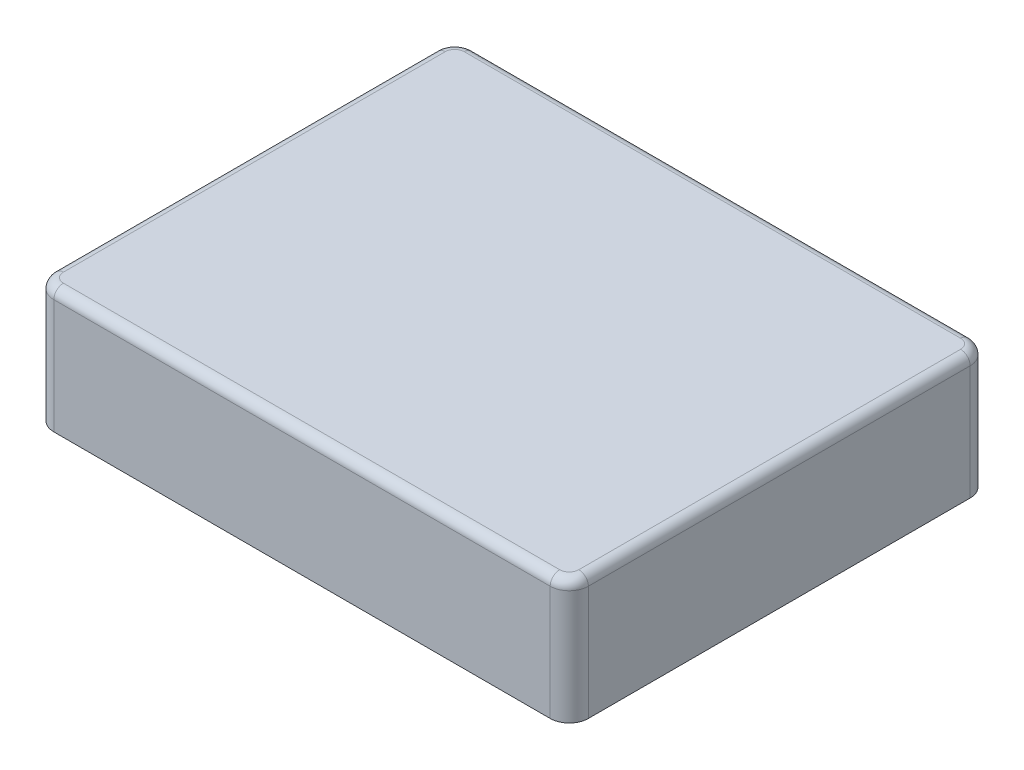
ISO-10303-21;
HEADER;
FILE_DESCRIPTION(('STEP AP214'),'2;1');
FILE_NAME('part.step','',(''),(''),'','','');
FILE_SCHEMA(('AUTOMOTIVE_DESIGN { 1 0 10303 214 1 1 1 1 }'));
ENDSEC;
DATA;
#1=APPLICATION_CONTEXT('core data for automotive mechanical design processes');
#2=APPLICATION_PROTOCOL_DEFINITION('international standard','automotive_design',2000,#1);
#3=PRODUCT_CONTEXT('',#1,'mechanical');
#4=PRODUCT('Part','Part','',(#3));
#5=PRODUCT_RELATED_PRODUCT_CATEGORY('part','',(#4));
#6=PRODUCT_DEFINITION_FORMATION('','',#4);
#7=PRODUCT_DEFINITION_CONTEXT('part definition',#1,'design');
#8=PRODUCT_DEFINITION('design','',#6,#7);
#9=PRODUCT_DEFINITION_SHAPE('','',#8);
#10=(LENGTH_UNIT() NAMED_UNIT(*) SI_UNIT(.MILLI.,.METRE.));
#11=(NAMED_UNIT(*) PLANE_ANGLE_UNIT() SI_UNIT($,.RADIAN.));
#12=(NAMED_UNIT(*) SI_UNIT($,.STERADIAN.) SOLID_ANGLE_UNIT());
#13=UNCERTAINTY_MEASURE_WITH_UNIT(LENGTH_MEASURE(1.E-05),#10,'distance_accuracy_value','');
#14=(GEOMETRIC_REPRESENTATION_CONTEXT(3) GLOBAL_UNCERTAINTY_ASSIGNED_CONTEXT((#13)) GLOBAL_UNIT_ASSIGNED_CONTEXT((#10,
#11,#12)) REPRESENTATION_CONTEXT('',''));
#15=CARTESIAN_POINT('',(0.,0.,0.));
#16=DIRECTION('',(0.,0.,1.));
#17=DIRECTION('',(1.,0.,0.));
#18=AXIS2_PLACEMENT_3D('',#15,#16,#17);
#19=CARTESIAN_POINT('',(0.,13.,0.));
#20=DIRECTION('',(0.,1.,0.));
#21=DIRECTION('',(0.,0.,1.));
#22=AXIS2_PLACEMENT_3D('',#19,#20,#21);
#23=PLANE('',#22);
#24=CARTESIAN_POINT('',(-26.,13.,-20.));
#25=DIRECTION('',(0.,1.,0.));
#26=DIRECTION('',(0.,0.,1.));
#27=AXIS2_PLACEMENT_3D('',#24,#25,#26);
#28=CIRCLE('',#27,1.);
#29=CARTESIAN_POINT('',(-27.,13.,-20.));
#30=VERTEX_POINT('',#29);
#31=CARTESIAN_POINT('',(-26.,13.,-21.));
#32=VERTEX_POINT('',#31);
#33=EDGE_CURVE('E278',#30,#32,#28,.F.);
#34=ORIENTED_EDGE('',*,*,#33,.F.);
#35=DIRECTION('',(0.,0.,1.));
#36=VECTOR('',#35,1.);
#37=CARTESIAN_POINT('',(-27.,13.,22.));
#38=LINE('',#37,#36);
#39=CARTESIAN_POINT('',(-27.,13.,20.));
#40=VERTEX_POINT('',#39);
#41=EDGE_CURVE('E245',#30,#40,#38,.T.);
#42=ORIENTED_EDGE('',*,*,#41,.T.);
#43=CARTESIAN_POINT('',(-26.,13.,20.));
#44=DIRECTION('',(0.,1.,0.));
#45=DIRECTION('',(0.,0.,1.));
#46=AXIS2_PLACEMENT_3D('',#43,#44,#45);
#47=CIRCLE('',#46,1.);
#48=CARTESIAN_POINT('',(-26.,13.,21.));
#49=VERTEX_POINT('',#48);
#50=EDGE_CURVE('E153',#49,#40,#47,.F.);
#51=ORIENTED_EDGE('',*,*,#50,.F.);
#52=DIRECTION('',(1.,0.,0.));
#53=VECTOR('',#52,1.);
#54=CARTESIAN_POINT('',(28.,13.,21.));
#55=LINE('',#54,#53);
#56=CARTESIAN_POINT('',(26.,13.,21.));
#57=VERTEX_POINT('',#56);
#58=EDGE_CURVE('E147',#49,#57,#55,.T.);
#59=ORIENTED_EDGE('',*,*,#58,.T.);
#60=CARTESIAN_POINT('',(26.,13.,20.));
#61=DIRECTION('',(0.,1.,0.));
#62=DIRECTION('',(0.,0.,1.));
#63=AXIS2_PLACEMENT_3D('',#60,#61,#62);
#64=CIRCLE('',#63,1.);
#65=CARTESIAN_POINT('',(27.,13.,20.));
#66=VERTEX_POINT('',#65);
#67=EDGE_CURVE('E141',#66,#57,#64,.F.);
#68=ORIENTED_EDGE('',*,*,#67,.F.);
#69=DIRECTION('',(0.,0.,-1.));
#70=VECTOR('',#69,1.);
#71=CARTESIAN_POINT('',(27.,13.,-22.));
#72=LINE('',#71,#70);
#73=CARTESIAN_POINT('',(27.,13.,-20.));
#74=VERTEX_POINT('',#73);
#75=EDGE_CURVE('E144',#66,#74,#72,.T.);
#76=ORIENTED_EDGE('',*,*,#75,.T.);
#77=CARTESIAN_POINT('',(26.,13.,-20.));
#78=DIRECTION('',(0.,1.,0.));
#79=DIRECTION('',(0.,0.,1.));
#80=AXIS2_PLACEMENT_3D('',#77,#78,#79);
#81=CIRCLE('',#80,1.);
#82=CARTESIAN_POINT('',(26.,13.,-21.));
#83=VERTEX_POINT('',#82);
#84=EDGE_CURVE('E154',#83,#74,#81,.F.);
#85=ORIENTED_EDGE('',*,*,#84,.F.);
#86=DIRECTION('',(-1.,0.,0.));
#87=VECTOR('',#86,1.);
#88=CARTESIAN_POINT('',(-28.,13.,-21.));
#89=LINE('',#88,#87);
#90=EDGE_CURVE('E165',#83,#32,#89,.T.);
#91=ORIENTED_EDGE('',*,*,#90,.T.);
#92=EDGE_LOOP('',(#34,#42,#51,#59,#68,#76,#85,#91));
#93=FACE_BOUND('',#92,.T.);
#94=ADVANCED_FACE('F48',(#93),#23,.T.);
#95=CARTESIAN_POINT('',(-28.,13.,-22.));
#96=DIRECTION('',(1.,0.,0.));
#97=DIRECTION('',(0.,0.,-1.));
#98=AXIS2_PLACEMENT_3D('',#95,#96,#97);
#99=PLANE('',#98);
#100=DIRECTION('',(0.,0.,1.));
#101=VECTOR('',#100,1.);
#102=CARTESIAN_POINT('',(-28.,0.,-22.));
#103=LINE('',#102,#101);
#104=CARTESIAN_POINT('',(-28.,0.,-20.));
#105=VERTEX_POINT('',#104);
#106=CARTESIAN_POINT('',(-28.,0.,20.));
#107=VERTEX_POINT('',#106);
#108=EDGE_CURVE('E215',#105,#107,#103,.T.);
#109=ORIENTED_EDGE('',*,*,#108,.T.);
#110=DIRECTION('',(0.,-1.,0.));
#111=VECTOR('',#110,1.);
#112=CARTESIAN_POINT('',(-28.,13.,20.));
#113=LINE('',#112,#111);
#114=CARTESIAN_POINT('',(-28.,12.,20.));
#115=VERTEX_POINT('',#114);
#116=EDGE_CURVE('E11',#107,#115,#113,.F.);
#117=ORIENTED_EDGE('',*,*,#116,.T.);
#118=DIRECTION('',(0.,0.,1.));
#119=VECTOR('',#118,1.);
#120=CARTESIAN_POINT('',(-28.,12.,-22.));
#121=LINE('',#120,#119);
#122=CARTESIAN_POINT('',(-28.,12.,-20.));
#123=VERTEX_POINT('',#122);
#124=EDGE_CURVE('E269',#115,#123,#121,.F.);
#125=ORIENTED_EDGE('',*,*,#124,.T.);
#126=DIRECTION('',(0.,-1.,0.));
#127=VECTOR('',#126,1.);
#128=CARTESIAN_POINT('',(-28.,13.,-20.));
#129=LINE('',#128,#127);
#130=EDGE_CURVE('E58',#123,#105,#129,.T.);
#131=ORIENTED_EDGE('',*,*,#130,.T.);
#132=EDGE_LOOP('',(#109,#117,#125,#131));
#133=FACE_BOUND('',#132,.T.);
#134=ADVANCED_FACE('F318',(#133),#99,.F.);
#135=CARTESIAN_POINT('',(-28.,13.,22.));
#136=DIRECTION('',(0.,0.,-1.));
#137=DIRECTION('',(-1.,0.,0.));
#138=AXIS2_PLACEMENT_3D('',#135,#136,#137);
#139=PLANE('',#138);
#140=DIRECTION('',(1.,0.,0.));
#141=VECTOR('',#140,1.);
#142=CARTESIAN_POINT('',(-28.,0.,22.));
#143=LINE('',#142,#141);
#144=CARTESIAN_POINT('',(-26.,0.,22.));
#145=VERTEX_POINT('',#144);
#146=CARTESIAN_POINT('',(26.,0.,22.));
#147=VERTEX_POINT('',#146);
#148=EDGE_CURVE('E252',#145,#147,#143,.T.);
#149=ORIENTED_EDGE('',*,*,#148,.T.);
#150=DIRECTION('',(0.,-1.,0.));
#151=VECTOR('',#150,1.);
#152=CARTESIAN_POINT('',(26.,13.,22.));
#153=LINE('',#152,#151);
#154=CARTESIAN_POINT('',(26.,12.,22.));
#155=VERTEX_POINT('',#154);
#156=EDGE_CURVE('E206',#147,#155,#153,.F.);
#157=ORIENTED_EDGE('',*,*,#156,.T.);
#158=DIRECTION('',(1.,0.,0.));
#159=VECTOR('',#158,1.);
#160=CARTESIAN_POINT('',(-28.,12.,22.));
#161=LINE('',#160,#159);
#162=CARTESIAN_POINT('',(-26.,12.,22.));
#163=VERTEX_POINT('',#162);
#164=EDGE_CURVE('E266',#155,#163,#161,.F.);
#165=ORIENTED_EDGE('',*,*,#164,.T.);
#166=DIRECTION('',(0.,-1.,0.));
#167=VECTOR('',#166,1.);
#168=CARTESIAN_POINT('',(-26.,13.,22.));
#169=LINE('',#168,#167);
#170=EDGE_CURVE('E73',#163,#145,#169,.T.);
#171=ORIENTED_EDGE('',*,*,#170,.T.);
#172=EDGE_LOOP('',(#149,#157,#165,#171));
#173=FACE_BOUND('',#172,.T.);
#174=ADVANCED_FACE('F297',(#173),#139,.F.);
#175=CARTESIAN_POINT('',(28.,13.,-22.));
#176=DIRECTION('',(-1.,0.,0.));
#177=DIRECTION('',(0.,0.,1.));
#178=AXIS2_PLACEMENT_3D('',#175,#176,#177);
#179=PLANE('',#178);
#180=DIRECTION('',(0.,0.,-1.));
#181=VECTOR('',#180,1.);
#182=CARTESIAN_POINT('',(28.,0.,-22.));
#183=LINE('',#182,#181);
#184=CARTESIAN_POINT('',(28.,0.,20.));
#185=VERTEX_POINT('',#184);
#186=CARTESIAN_POINT('',(28.,0.,-20.));
#187=VERTEX_POINT('',#186);
#188=EDGE_CURVE('E246',#185,#187,#183,.T.);
#189=ORIENTED_EDGE('',*,*,#188,.T.);
#190=DIRECTION('',(0.,-1.,0.));
#191=VECTOR('',#190,1.);
#192=CARTESIAN_POINT('',(28.,13.,-20.));
#193=LINE('',#192,#191);
#194=CARTESIAN_POINT('',(28.,12.,-20.));
#195=VERTEX_POINT('',#194);
#196=EDGE_CURVE('E201',#187,#195,#193,.F.);
#197=ORIENTED_EDGE('',*,*,#196,.T.);
#198=DIRECTION('',(0.,0.,-1.));
#199=VECTOR('',#198,1.);
#200=CARTESIAN_POINT('',(28.,12.,22.));
#201=LINE('',#200,#199);
#202=CARTESIAN_POINT('',(28.,12.,20.));
#203=VERTEX_POINT('',#202);
#204=EDGE_CURVE('E263',#195,#203,#201,.F.);
#205=ORIENTED_EDGE('',*,*,#204,.T.);
#206=DIRECTION('',(0.,-1.,0.));
#207=VECTOR('',#206,1.);
#208=CARTESIAN_POINT('',(28.,13.,20.));
#209=LINE('',#208,#207);
#210=EDGE_CURVE('E198',#203,#185,#209,.T.);
#211=ORIENTED_EDGE('',*,*,#210,.T.);
#212=EDGE_LOOP('',(#189,#197,#205,#211));
#213=FACE_BOUND('',#212,.T.);
#214=ADVANCED_FACE('F342',(#213),#179,.F.);
#215=CARTESIAN_POINT('',(-28.,13.,-22.));
#216=DIRECTION('',(0.,0.,1.));
#217=DIRECTION('',(1.,0.,0.));
#218=AXIS2_PLACEMENT_3D('',#215,#216,#217);
#219=PLANE('',#218);
#220=DIRECTION('',(-1.,0.,0.));
#221=VECTOR('',#220,1.);
#222=CARTESIAN_POINT('',(28.,12.,-22.));
#223=LINE('',#222,#221);
#224=CARTESIAN_POINT('',(-26.,12.,-22.));
#225=VERTEX_POINT('',#224);
#226=CARTESIAN_POINT('',(26.,12.,-22.));
#227=VERTEX_POINT('',#226);
#228=EDGE_CURVE('E239',#225,#227,#223,.F.);
#229=ORIENTED_EDGE('',*,*,#228,.T.);
#230=DIRECTION('',(0.,-1.,0.));
#231=VECTOR('',#230,1.);
#232=CARTESIAN_POINT('',(26.,13.,-22.));
#233=LINE('',#232,#231);
#234=CARTESIAN_POINT('',(26.,0.,-22.));
#235=VERTEX_POINT('',#234);
#236=EDGE_CURVE('E184',#227,#235,#233,.T.);
#237=ORIENTED_EDGE('',*,*,#236,.T.);
#238=DIRECTION('',(-1.,0.,0.));
#239=VECTOR('',#238,1.);
#240=CARTESIAN_POINT('',(-28.,0.,-22.));
#241=LINE('',#240,#239);
#242=CARTESIAN_POINT('',(-26.,0.,-22.));
#243=VERTEX_POINT('',#242);
#244=EDGE_CURVE('E236',#235,#243,#241,.T.);
#245=ORIENTED_EDGE('',*,*,#244,.T.);
#246=DIRECTION('',(0.,-1.,0.));
#247=VECTOR('',#246,1.);
#248=CARTESIAN_POINT('',(-26.,13.,-22.));
#249=LINE('',#248,#247);
#250=EDGE_CURVE('E176',#243,#225,#249,.F.);
#251=ORIENTED_EDGE('',*,*,#250,.T.);
#252=EDGE_LOOP('',(#229,#237,#245,#251));
#253=FACE_BOUND('',#252,.T.);
#254=ADVANCED_FACE('F235',(#253),#219,.F.);
#255=CARTESIAN_POINT('',(0.,0.,0.));
#256=DIRECTION('',(0.,1.,0.));
#257=DIRECTION('',(0.,0.,1.));
#258=AXIS2_PLACEMENT_3D('',#255,#256,#257);
#259=PLANE('',#258);
#260=ORIENTED_EDGE('',*,*,#244,.F.);
#261=CARTESIAN_POINT('',(26.,0.,-20.));
#262=DIRECTION('',(0.,1.,0.));
#263=DIRECTION('',(0.,0.,1.));
#264=AXIS2_PLACEMENT_3D('',#261,#262,#263);
#265=CIRCLE('',#264,2.);
#266=EDGE_CURVE('E195',#235,#187,#265,.F.);
#267=ORIENTED_EDGE('',*,*,#266,.T.);
#268=ORIENTED_EDGE('',*,*,#188,.F.);
#269=CARTESIAN_POINT('',(26.,0.,20.));
#270=DIRECTION('',(0.,1.,0.));
#271=DIRECTION('',(0.,0.,1.));
#272=AXIS2_PLACEMENT_3D('',#269,#270,#271);
#273=CIRCLE('',#272,2.);
#274=EDGE_CURVE('E66',#185,#147,#273,.F.);
#275=ORIENTED_EDGE('',*,*,#274,.T.);
#276=ORIENTED_EDGE('',*,*,#148,.F.);
#277=CARTESIAN_POINT('',(-26.,0.,20.));
#278=DIRECTION('',(0.,1.,0.));
#279=DIRECTION('',(0.,0.,1.));
#280=AXIS2_PLACEMENT_3D('',#277,#278,#279);
#281=CIRCLE('',#280,2.);
#282=EDGE_CURVE('E190',#145,#107,#281,.F.);
#283=ORIENTED_EDGE('',*,*,#282,.T.);
#284=ORIENTED_EDGE('',*,*,#108,.F.);
#285=CARTESIAN_POINT('',(-26.,0.,-20.));
#286=DIRECTION('',(0.,1.,0.));
#287=DIRECTION('',(0.,0.,1.));
#288=AXIS2_PLACEMENT_3D('',#285,#286,#287);
#289=CIRCLE('',#288,2.);
#290=EDGE_CURVE('E187',#105,#243,#289,.F.);
#291=ORIENTED_EDGE('',*,*,#290,.T.);
#292=EDGE_LOOP('',(#260,#267,#268,#275,#276,#283,#284,#291));
#293=FACE_BOUND('',#292,.T.);
#294=ADVANCED_FACE('F240',(#293),#259,.F.);
#295=CARTESIAN_POINT('',(0.,12.,21.));
#296=DIRECTION('',(-1.,0.,0.));
#297=DIRECTION('',(0.,0.,1.));
#298=AXIS2_PLACEMENT_3D('',#295,#296,#297);
#299=CYLINDRICAL_SURFACE('',#298,1.);
#300=ORIENTED_EDGE('',*,*,#164,.F.);
#301=CARTESIAN_POINT('',(26.,12.,21.));
#302=DIRECTION('',(-1.,0.,0.));
#303=DIRECTION('',(0.,0.,1.));
#304=AXIS2_PLACEMENT_3D('',#301,#302,#303);
#305=CIRCLE('',#304,1.);
#306=EDGE_CURVE('E172',#155,#57,#305,.T.);
#307=ORIENTED_EDGE('',*,*,#306,.T.);
#308=ORIENTED_EDGE('',*,*,#58,.F.);
#309=CARTESIAN_POINT('',(-26.,12.,21.));
#310=DIRECTION('',(1.,0.,0.));
#311=DIRECTION('',(0.,0.,-1.));
#312=AXIS2_PLACEMENT_3D('',#309,#310,#311);
#313=CIRCLE('',#312,1.);
#314=EDGE_CURVE('E178',#49,#163,#313,.T.);
#315=ORIENTED_EDGE('',*,*,#314,.T.);
#316=EDGE_LOOP('',(#300,#307,#308,#315));
#317=FACE_BOUND('',#316,.T.);
#318=ADVANCED_FACE('F295',(#317),#299,.T.);
#319=CARTESIAN_POINT('',(27.,12.,0.));
#320=DIRECTION('',(0.,0.,1.));
#321=DIRECTION('',(1.,0.,0.));
#322=AXIS2_PLACEMENT_3D('',#319,#320,#321);
#323=CYLINDRICAL_SURFACE('',#322,1.);
#324=ORIENTED_EDGE('',*,*,#204,.F.);
#325=CARTESIAN_POINT('',(27.,12.,-20.));
#326=DIRECTION('',(0.,0.,1.));
#327=DIRECTION('',(1.,0.,0.));
#328=AXIS2_PLACEMENT_3D('',#325,#326,#327);
#329=CIRCLE('',#328,1.);
#330=EDGE_CURVE('E163',#195,#74,#329,.T.);
#331=ORIENTED_EDGE('',*,*,#330,.T.);
#332=ORIENTED_EDGE('',*,*,#75,.F.);
#333=CARTESIAN_POINT('',(27.,12.,20.));
#334=DIRECTION('',(0.,0.,-1.));
#335=DIRECTION('',(-1.,0.,0.));
#336=AXIS2_PLACEMENT_3D('',#333,#334,#335);
#337=CIRCLE('',#336,1.);
#338=EDGE_CURVE('E160',#66,#203,#337,.T.);
#339=ORIENTED_EDGE('',*,*,#338,.T.);
#340=EDGE_LOOP('',(#324,#331,#332,#339));
#341=FACE_BOUND('',#340,.T.);
#342=ADVANCED_FACE('F159',(#341),#323,.T.);
#343=CARTESIAN_POINT('',(-27.,12.,0.));
#344=DIRECTION('',(0.,0.,-1.));
#345=DIRECTION('',(-1.,0.,0.));
#346=AXIS2_PLACEMENT_3D('',#343,#344,#345);
#347=CYLINDRICAL_SURFACE('',#346,1.);
#348=ORIENTED_EDGE('',*,*,#124,.F.);
#349=CARTESIAN_POINT('',(-27.,12.,20.));
#350=DIRECTION('',(0.,0.,-1.));
#351=DIRECTION('',(-1.,0.,0.));
#352=AXIS2_PLACEMENT_3D('',#349,#350,#351);
#353=CIRCLE('',#352,1.);
#354=EDGE_CURVE('E290',#115,#40,#353,.T.);
#355=ORIENTED_EDGE('',*,*,#354,.T.);
#356=ORIENTED_EDGE('',*,*,#41,.F.);
#357=CARTESIAN_POINT('',(-27.,12.,-20.));
#358=DIRECTION('',(0.,0.,1.));
#359=DIRECTION('',(1.,0.,0.));
#360=AXIS2_PLACEMENT_3D('',#357,#358,#359);
#361=CIRCLE('',#360,1.);
#362=EDGE_CURVE('E287',#30,#123,#361,.T.);
#363=ORIENTED_EDGE('',*,*,#362,.T.);
#364=EDGE_LOOP('',(#348,#355,#356,#363));
#365=FACE_BOUND('',#364,.T.);
#366=ADVANCED_FACE('F309',(#365),#347,.T.);
#367=CARTESIAN_POINT('',(0.,12.,-21.));
#368=DIRECTION('',(1.,0.,0.));
#369=DIRECTION('',(0.,0.,-1.));
#370=AXIS2_PLACEMENT_3D('',#367,#368,#369);
#371=CYLINDRICAL_SURFACE('',#370,1.);
#372=ORIENTED_EDGE('',*,*,#228,.F.);
#373=CARTESIAN_POINT('',(-26.,12.,-21.));
#374=DIRECTION('',(1.,0.,0.));
#375=DIRECTION('',(0.,0.,-1.));
#376=AXIS2_PLACEMENT_3D('',#373,#374,#375);
#377=CIRCLE('',#376,1.);
#378=EDGE_CURVE('E284',#225,#32,#377,.T.);
#379=ORIENTED_EDGE('',*,*,#378,.T.);
#380=ORIENTED_EDGE('',*,*,#90,.F.);
#381=CARTESIAN_POINT('',(26.,12.,-21.));
#382=DIRECTION('',(-1.,0.,0.));
#383=DIRECTION('',(0.,0.,1.));
#384=AXIS2_PLACEMENT_3D('',#381,#382,#383);
#385=CIRCLE('',#384,1.);
#386=EDGE_CURVE('E226',#83,#227,#385,.T.);
#387=ORIENTED_EDGE('',*,*,#386,.T.);
#388=EDGE_LOOP('',(#372,#379,#380,#387));
#389=FACE_BOUND('',#388,.T.);
#390=ADVANCED_FACE('F322',(#389),#371,.T.);
#391=CARTESIAN_POINT('',(-26.,13.,-20.));
#392=DIRECTION('',(0.,-1.,0.));
#393=DIRECTION('',(0.,0.,-1.));
#394=AXIS2_PLACEMENT_3D('',#391,#392,#393);
#395=CYLINDRICAL_SURFACE('',#394,2.);
#396=ORIENTED_EDGE('',*,*,#290,.F.);
#397=ORIENTED_EDGE('',*,*,#130,.F.);
#398=CARTESIAN_POINT('',(-26.,12.,-20.));
#399=DIRECTION('',(0.,1.,0.));
#400=DIRECTION('',(0.,0.,1.));
#401=AXIS2_PLACEMENT_3D('',#398,#399,#400);
#402=CIRCLE('',#401,2.);
#403=EDGE_CURVE('E211',#225,#123,#402,.T.);
#404=ORIENTED_EDGE('',*,*,#403,.F.);
#405=ORIENTED_EDGE('',*,*,#250,.F.);
#406=EDGE_LOOP('',(#396,#397,#404,#405));
#407=FACE_BOUND('',#406,.T.);
#408=ADVANCED_FACE('F320',(#407),#395,.T.);
#409=CARTESIAN_POINT('',(-26.,12.,-20.));
#410=DIRECTION('',(0.,1.,0.));
#411=DIRECTION('',(0.,0.,1.));
#412=AXIS2_PLACEMENT_3D('',#409,#410,#411);
#413=DEGENERATE_TOROIDAL_SURFACE('',#412,1.,1.,.T.);
#414=ORIENTED_EDGE('',*,*,#362,.F.);
#415=ORIENTED_EDGE('',*,*,#33,.T.);
#416=ORIENTED_EDGE('',*,*,#378,.F.);
#417=ORIENTED_EDGE('',*,*,#403,.T.);
#418=EDGE_LOOP('',(#414,#415,#416,#417));
#419=FACE_BOUND('',#418,.T.);
#420=ADVANCED_FACE('F313',(#419),#413,.T.);
#421=CARTESIAN_POINT('',(-26.,13.,20.));
#422=DIRECTION('',(0.,-1.,0.));
#423=DIRECTION('',(0.,0.,-1.));
#424=AXIS2_PLACEMENT_3D('',#421,#422,#423);
#425=CYLINDRICAL_SURFACE('',#424,2.);
#426=ORIENTED_EDGE('',*,*,#282,.F.);
#427=ORIENTED_EDGE('',*,*,#170,.F.);
#428=CARTESIAN_POINT('',(-26.,12.,20.));
#429=DIRECTION('',(0.,1.,0.));
#430=DIRECTION('',(0.,0.,1.));
#431=AXIS2_PLACEMENT_3D('',#428,#429,#430);
#432=CIRCLE('',#431,2.);
#433=EDGE_CURVE('E216',#115,#163,#432,.T.);
#434=ORIENTED_EDGE('',*,*,#433,.F.);
#435=ORIENTED_EDGE('',*,*,#116,.F.);
#436=EDGE_LOOP('',(#426,#427,#434,#435));
#437=FACE_BOUND('',#436,.T.);
#438=ADVANCED_FACE('F302',(#437),#425,.T.);
#439=CARTESIAN_POINT('',(-26.,12.,20.));
#440=DIRECTION('',(0.,1.,0.));
#441=DIRECTION('',(0.,0.,1.));
#442=AXIS2_PLACEMENT_3D('',#439,#440,#441);
#443=DEGENERATE_TOROIDAL_SURFACE('',#442,1.,1.,.T.);
#444=ORIENTED_EDGE('',*,*,#314,.F.);
#445=ORIENTED_EDGE('',*,*,#50,.T.);
#446=ORIENTED_EDGE('',*,*,#354,.F.);
#447=ORIENTED_EDGE('',*,*,#433,.T.);
#448=EDGE_LOOP('',(#444,#445,#446,#447));
#449=FACE_BOUND('',#448,.T.);
#450=ADVANCED_FACE('F305',(#449),#443,.T.);
#451=CARTESIAN_POINT('',(26.,13.,20.));
#452=DIRECTION('',(0.,-1.,0.));
#453=DIRECTION('',(0.,0.,-1.));
#454=AXIS2_PLACEMENT_3D('',#451,#452,#453);
#455=CYLINDRICAL_SURFACE('',#454,2.);
#456=ORIENTED_EDGE('',*,*,#274,.F.);
#457=ORIENTED_EDGE('',*,*,#210,.F.);
#458=CARTESIAN_POINT('',(26.,12.,20.));
#459=DIRECTION('',(0.,1.,0.));
#460=DIRECTION('',(0.,0.,1.));
#461=AXIS2_PLACEMENT_3D('',#458,#459,#460);
#462=CIRCLE('',#461,2.);
#463=EDGE_CURVE('E170',#155,#203,#462,.T.);
#464=ORIENTED_EDGE('',*,*,#463,.F.);
#465=ORIENTED_EDGE('',*,*,#156,.F.);
#466=EDGE_LOOP('',(#456,#457,#464,#465));
#467=FACE_BOUND('',#466,.T.);
#468=ADVANCED_FACE('F418',(#467),#455,.T.);
#469=CARTESIAN_POINT('',(26.,12.,20.));
#470=DIRECTION('',(0.,1.,0.));
#471=DIRECTION('',(0.,0.,1.));
#472=AXIS2_PLACEMENT_3D('',#469,#470,#471);
#473=DEGENERATE_TOROIDAL_SURFACE('',#472,1.,1.,.T.);
#474=ORIENTED_EDGE('',*,*,#306,.F.);
#475=ORIENTED_EDGE('',*,*,#463,.T.);
#476=ORIENTED_EDGE('',*,*,#338,.F.);
#477=ORIENTED_EDGE('',*,*,#67,.T.);
#478=EDGE_LOOP('',(#474,#475,#476,#477));
#479=FACE_BOUND('',#478,.T.);
#480=ADVANCED_FACE('F168',(#479),#473,.T.);
#481=CARTESIAN_POINT('',(26.,13.,-20.));
#482=DIRECTION('',(0.,-1.,0.));
#483=DIRECTION('',(0.,0.,-1.));
#484=AXIS2_PLACEMENT_3D('',#481,#482,#483);
#485=CYLINDRICAL_SURFACE('',#484,2.);
#486=ORIENTED_EDGE('',*,*,#266,.F.);
#487=ORIENTED_EDGE('',*,*,#236,.F.);
#488=CARTESIAN_POINT('',(26.,12.,-20.));
#489=DIRECTION('',(0.,1.,0.));
#490=DIRECTION('',(0.,0.,1.));
#491=AXIS2_PLACEMENT_3D('',#488,#489,#490);
#492=CIRCLE('',#491,2.);
#493=EDGE_CURVE('E52',#195,#227,#492,.T.);
#494=ORIENTED_EDGE('',*,*,#493,.F.);
#495=ORIENTED_EDGE('',*,*,#196,.F.);
#496=EDGE_LOOP('',(#486,#487,#494,#495));
#497=FACE_BOUND('',#496,.T.);
#498=ADVANCED_FACE('F50',(#497),#485,.T.);
#499=CARTESIAN_POINT('',(26.,12.,-20.));
#500=DIRECTION('',(0.,1.,0.));
#501=DIRECTION('',(0.,0.,1.));
#502=AXIS2_PLACEMENT_3D('',#499,#500,#501);
#503=DEGENERATE_TOROIDAL_SURFACE('',#502,1.,1.,.T.);
#504=ORIENTED_EDGE('',*,*,#330,.F.);
#505=ORIENTED_EDGE('',*,*,#493,.T.);
#506=ORIENTED_EDGE('',*,*,#386,.F.);
#507=ORIENTED_EDGE('',*,*,#84,.T.);
#508=EDGE_LOOP('',(#504,#505,#506,#507));
#509=FACE_BOUND('',#508,.T.);
#510=ADVANCED_FACE('F225',(#509),#503,.T.);
#511=CLOSED_SHELL('',(#94,#134,#174,#214,#254,#294,#318,#342,#366,#390,#408,#420,#438,#450,#468,
#480,#498,#510));
#512=MANIFOLD_SOLID_BREP('B2',#511);
#513=ADVANCED_BREP_SHAPE_REPRESENTATION('',(#18,#512),#14);
#514=SHAPE_DEFINITION_REPRESENTATION(#9,#513);
ENDSEC;
END-ISO-10303-21;
